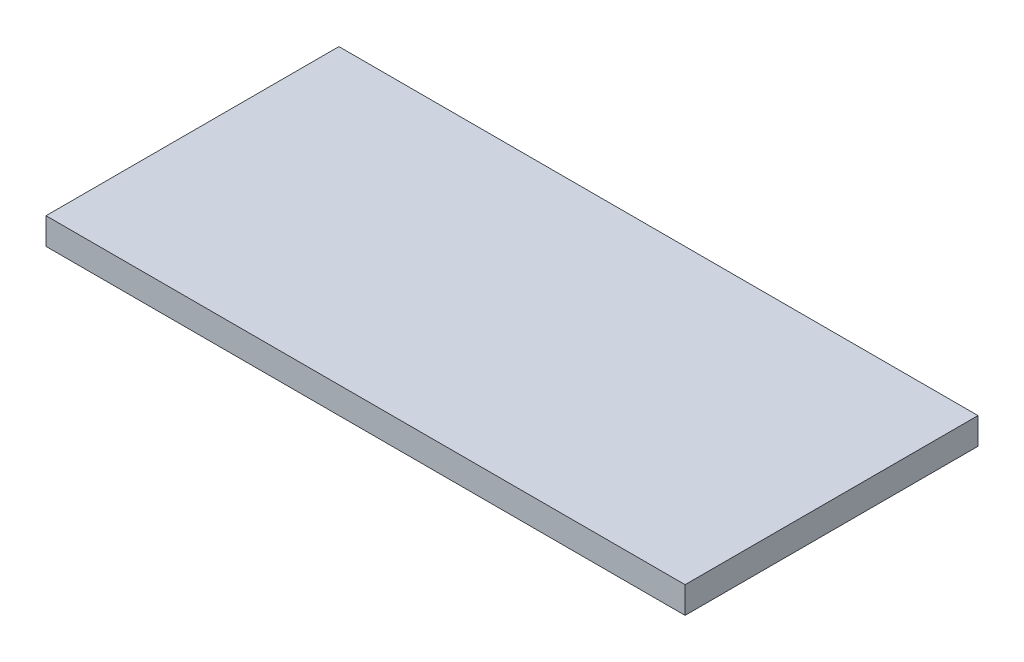
ISO-10303-21;
HEADER;
FILE_DESCRIPTION(('STEP AP214'),'2;1');
FILE_NAME('part.step','',(''),(''),'','','');
FILE_SCHEMA(('AUTOMOTIVE_DESIGN { 1 0 10303 214 1 1 1 1 }'));
ENDSEC;
DATA;
#1=APPLICATION_CONTEXT('core data for automotive mechanical design processes');
#2=APPLICATION_PROTOCOL_DEFINITION('international standard','automotive_design',2000,#1);
#3=PRODUCT_CONTEXT('',#1,'mechanical');
#4=PRODUCT('Part','Part','',(#3));
#5=PRODUCT_RELATED_PRODUCT_CATEGORY('part','',(#4));
#6=PRODUCT_DEFINITION_FORMATION('','',#4);
#7=PRODUCT_DEFINITION_CONTEXT('part definition',#1,'design');
#8=PRODUCT_DEFINITION('design','',#6,#7);
#9=PRODUCT_DEFINITION_SHAPE('','',#8);
#10=(LENGTH_UNIT() NAMED_UNIT(*) SI_UNIT(.MILLI.,.METRE.));
#11=(NAMED_UNIT(*) PLANE_ANGLE_UNIT() SI_UNIT($,.RADIAN.));
#12=(NAMED_UNIT(*) SI_UNIT($,.STERADIAN.) SOLID_ANGLE_UNIT());
#13=UNCERTAINTY_MEASURE_WITH_UNIT(LENGTH_MEASURE(1.E-05),#10,'distance_accuracy_value','');
#14=(GEOMETRIC_REPRESENTATION_CONTEXT(3) GLOBAL_UNCERTAINTY_ASSIGNED_CONTEXT((#13)) GLOBAL_UNIT_ASSIGNED_CONTEXT((#10,
#11,#12)) REPRESENTATION_CONTEXT('',''));
#15=CARTESIAN_POINT('',(0.,0.,0.));
#16=DIRECTION('',(0.,0.,1.));
#17=DIRECTION('',(1.,0.,0.));
#18=AXIS2_PLACEMENT_3D('',#15,#16,#17);
#19=CARTESIAN_POINT('',(600.,50.,-275.));
#20=DIRECTION('',(-1.,0.,0.));
#21=DIRECTION('',(0.,0.,1.));
#22=AXIS2_PLACEMENT_3D('',#19,#20,#21);
#23=PLANE('',#22);
#24=DIRECTION('',(0.,0.,-1.));
#25=VECTOR('',#24,1.);
#26=CARTESIAN_POINT('',(600.,0.,-275.));
#27=LINE('',#26,#25);
#28=CARTESIAN_POINT('',(600.,0.,275.));
#29=VERTEX_POINT('',#28);
#30=CARTESIAN_POINT('',(600.,0.,-275.));
#31=VERTEX_POINT('',#30);
#32=EDGE_CURVE('E117',#29,#31,#27,.T.);
#33=ORIENTED_EDGE('',*,*,#32,.T.);
#34=DIRECTION('',(0.,-1.,0.));
#35=VECTOR('',#34,1.);
#36=CARTESIAN_POINT('',(600.,50.,-275.));
#37=LINE('',#36,#35);
#38=CARTESIAN_POINT('',(600.,50.,-275.));
#39=VERTEX_POINT('',#38);
#40=EDGE_CURVE('E11',#39,#31,#37,.T.);
#41=ORIENTED_EDGE('',*,*,#40,.F.);
#42=DIRECTION('',(0.,0.,-1.));
#43=VECTOR('',#42,1.);
#44=CARTESIAN_POINT('',(600.,50.,-275.));
#45=LINE('',#44,#43);
#46=CARTESIAN_POINT('',(600.,50.,275.));
#47=VERTEX_POINT('',#46);
#48=EDGE_CURVE('E101',#47,#39,#45,.T.);
#49=ORIENTED_EDGE('',*,*,#48,.F.);
#50=DIRECTION('',(0.,-1.,0.));
#51=VECTOR('',#50,1.);
#52=CARTESIAN_POINT('',(600.,50.,275.));
#53=LINE('',#52,#51);
#54=EDGE_CURVE('E113',#47,#29,#53,.T.);
#55=ORIENTED_EDGE('',*,*,#54,.T.);
#56=EDGE_LOOP('',(#33,#41,#49,#55));
#57=FACE_BOUND('',#56,.T.);
#58=ADVANCED_FACE('F49',(#57),#23,.F.);
#59=CARTESIAN_POINT('',(-600.,50.,-275.));
#60=DIRECTION('',(0.,0.,1.));
#61=DIRECTION('',(1.,0.,0.));
#62=AXIS2_PLACEMENT_3D('',#59,#60,#61);
#63=PLANE('',#62);
#64=DIRECTION('',(-1.,0.,0.));
#65=VECTOR('',#64,1.);
#66=CARTESIAN_POINT('',(-600.,0.,-275.));
#67=LINE('',#66,#65);
#68=CARTESIAN_POINT('',(-600.,0.,-275.));
#69=VERTEX_POINT('',#68);
#70=EDGE_CURVE('E106',#31,#69,#67,.T.);
#71=ORIENTED_EDGE('',*,*,#70,.T.);
#72=DIRECTION('',(0.,-1.,0.));
#73=VECTOR('',#72,1.);
#74=CARTESIAN_POINT('',(-600.,50.,-275.));
#75=LINE('',#74,#73);
#76=CARTESIAN_POINT('',(-600.,50.,-275.));
#77=VERTEX_POINT('',#76);
#78=EDGE_CURVE('E58',#77,#69,#75,.T.);
#79=ORIENTED_EDGE('',*,*,#78,.F.);
#80=DIRECTION('',(-1.,0.,0.));
#81=VECTOR('',#80,1.);
#82=CARTESIAN_POINT('',(-600.,50.,-275.));
#83=LINE('',#82,#81);
#84=EDGE_CURVE('E96',#39,#77,#83,.T.);
#85=ORIENTED_EDGE('',*,*,#84,.F.);
#86=ORIENTED_EDGE('',*,*,#40,.T.);
#87=EDGE_LOOP('',(#71,#79,#85,#86));
#88=FACE_BOUND('',#87,.T.);
#89=ADVANCED_FACE('F105',(#88),#63,.F.);
#90=CARTESIAN_POINT('',(-600.,50.,-275.));
#91=DIRECTION('',(1.,0.,0.));
#92=DIRECTION('',(0.,0.,-1.));
#93=AXIS2_PLACEMENT_3D('',#90,#91,#92);
#94=PLANE('',#93);
#95=DIRECTION('',(0.,0.,1.));
#96=VECTOR('',#95,1.);
#97=CARTESIAN_POINT('',(-600.,0.,-275.));
#98=LINE('',#97,#96);
#99=CARTESIAN_POINT('',(-600.,0.,275.));
#100=VERTEX_POINT('',#99);
#101=EDGE_CURVE('E83',#69,#100,#98,.T.);
#102=ORIENTED_EDGE('',*,*,#101,.T.);
#103=DIRECTION('',(0.,-1.,0.));
#104=VECTOR('',#103,1.);
#105=CARTESIAN_POINT('',(-600.,50.,275.));
#106=LINE('',#105,#104);
#107=CARTESIAN_POINT('',(-600.,50.,275.));
#108=VERTEX_POINT('',#107);
#109=EDGE_CURVE('E108',#108,#100,#106,.T.);
#110=ORIENTED_EDGE('',*,*,#109,.F.);
#111=DIRECTION('',(0.,0.,1.));
#112=VECTOR('',#111,1.);
#113=CARTESIAN_POINT('',(-600.,50.,-275.));
#114=LINE('',#113,#112);
#115=EDGE_CURVE('E99',#77,#108,#114,.T.);
#116=ORIENTED_EDGE('',*,*,#115,.F.);
#117=ORIENTED_EDGE('',*,*,#78,.T.);
#118=EDGE_LOOP('',(#102,#110,#116,#117));
#119=FACE_BOUND('',#118,.T.);
#120=ADVANCED_FACE('F109',(#119),#94,.F.);
#121=CARTESIAN_POINT('',(-600.,50.,275.));
#122=DIRECTION('',(0.,0.,-1.));
#123=DIRECTION('',(-1.,0.,0.));
#124=AXIS2_PLACEMENT_3D('',#121,#122,#123);
#125=PLANE('',#124);
#126=DIRECTION('',(1.,0.,0.));
#127=VECTOR('',#126,1.);
#128=CARTESIAN_POINT('',(-600.,0.,275.));
#129=LINE('',#128,#127);
#130=EDGE_CURVE('E89',#100,#29,#129,.T.);
#131=ORIENTED_EDGE('',*,*,#130,.T.);
#132=ORIENTED_EDGE('',*,*,#54,.F.);
#133=DIRECTION('',(1.,0.,0.));
#134=VECTOR('',#133,1.);
#135=CARTESIAN_POINT('',(-600.,50.,275.));
#136=LINE('',#135,#134);
#137=EDGE_CURVE('E66',#108,#47,#136,.T.);
#138=ORIENTED_EDGE('',*,*,#137,.F.);
#139=ORIENTED_EDGE('',*,*,#109,.T.);
#140=EDGE_LOOP('',(#131,#132,#138,#139));
#141=FACE_BOUND('',#140,.T.);
#142=ADVANCED_FACE('F130',(#141),#125,.F.);
#143=CARTESIAN_POINT('',(0.,50.,0.));
#144=DIRECTION('',(0.,1.,0.));
#145=DIRECTION('',(0.,0.,1.));
#146=AXIS2_PLACEMENT_3D('',#143,#144,#145);
#147=PLANE('',#146);
#148=ORIENTED_EDGE('',*,*,#48,.T.);
#149=ORIENTED_EDGE('',*,*,#84,.T.);
#150=ORIENTED_EDGE('',*,*,#115,.T.);
#151=ORIENTED_EDGE('',*,*,#137,.T.);
#152=EDGE_LOOP('',(#148,#149,#150,#151));
#153=FACE_BOUND('',#152,.T.);
#154=ADVANCED_FACE('F97',(#153),#147,.T.);
#155=CARTESIAN_POINT('',(0.,0.,0.));
#156=DIRECTION('',(0.,1.,0.));
#157=DIRECTION('',(0.,0.,1.));
#158=AXIS2_PLACEMENT_3D('',#155,#156,#157);
#159=PLANE('',#158);
#160=ORIENTED_EDGE('',*,*,#32,.F.);
#161=ORIENTED_EDGE('',*,*,#130,.F.);
#162=ORIENTED_EDGE('',*,*,#101,.F.);
#163=ORIENTED_EDGE('',*,*,#70,.F.);
#164=EDGE_LOOP('',(#160,#161,#162,#163));
#165=FACE_BOUND('',#164,.T.);
#166=ADVANCED_FACE('F133',(#165),#159,.F.);
#167=CLOSED_SHELL('',(#58,#89,#120,#142,#154,#166));
#168=MANIFOLD_SOLID_BREP('B2',#167);
#169=ADVANCED_BREP_SHAPE_REPRESENTATION('',(#18,#168),#14);
#170=SHAPE_DEFINITION_REPRESENTATION(#9,#169);
ENDSEC;
END-ISO-10303-21;
